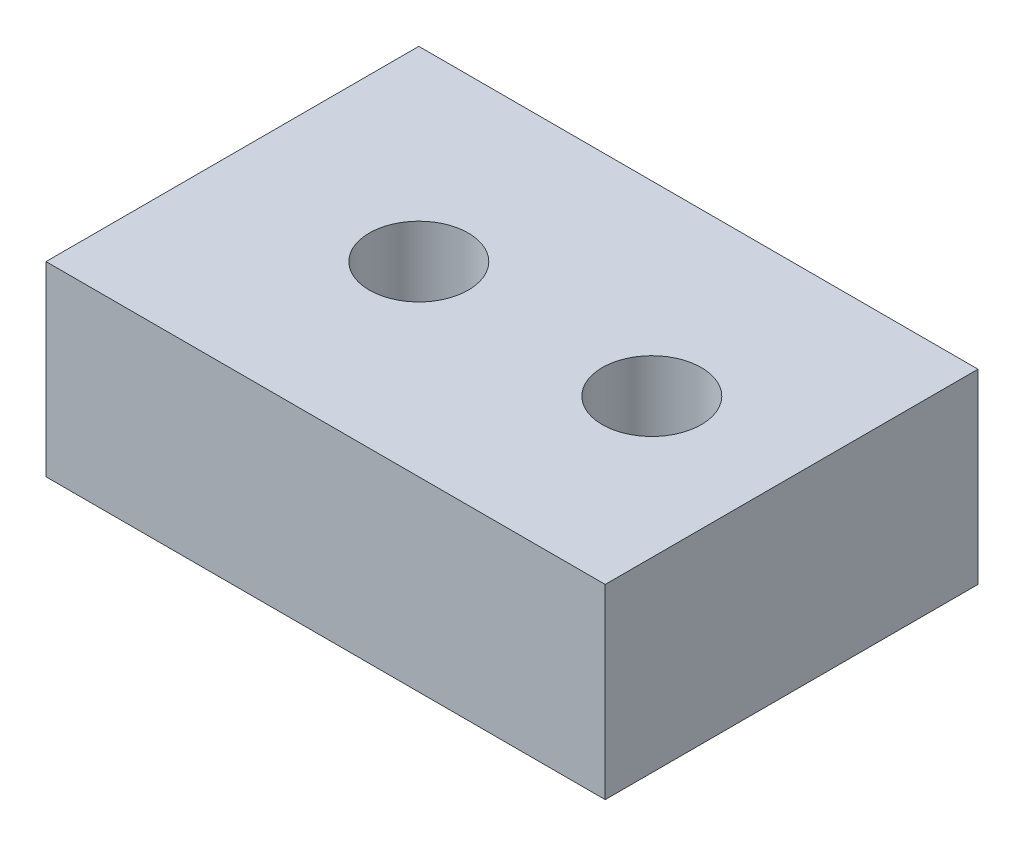
ISO-10303-21;
HEADER;
FILE_DESCRIPTION(('STEP AP214'),'2;1');
FILE_NAME('part.step','',(''),(''),'','','');
FILE_SCHEMA(('AUTOMOTIVE_DESIGN { 1 0 10303 214 1 1 1 1 }'));
ENDSEC;
DATA;
#1=APPLICATION_CONTEXT('core data for automotive mechanical design processes');
#2=APPLICATION_PROTOCOL_DEFINITION('international standard','automotive_design',2000,#1);
#3=PRODUCT_CONTEXT('',#1,'mechanical');
#4=PRODUCT('Part','Part','',(#3));
#5=PRODUCT_RELATED_PRODUCT_CATEGORY('part','',(#4));
#6=PRODUCT_DEFINITION_FORMATION('','',#4);
#7=PRODUCT_DEFINITION_CONTEXT('part definition',#1,'design');
#8=PRODUCT_DEFINITION('design','',#6,#7);
#9=PRODUCT_DEFINITION_SHAPE('','',#8);
#10=(LENGTH_UNIT() NAMED_UNIT(*) SI_UNIT(.MILLI.,.METRE.));
#11=(NAMED_UNIT(*) PLANE_ANGLE_UNIT() SI_UNIT($,.RADIAN.));
#12=(NAMED_UNIT(*) SI_UNIT($,.STERADIAN.) SOLID_ANGLE_UNIT());
#13=UNCERTAINTY_MEASURE_WITH_UNIT(LENGTH_MEASURE(1.E-05),#10,'distance_accuracy_value','');
#14=(GEOMETRIC_REPRESENTATION_CONTEXT(3) GLOBAL_UNCERTAINTY_ASSIGNED_CONTEXT((#13)) GLOBAL_UNIT_ASSIGNED_CONTEXT((#10,
#11,#12)) REPRESENTATION_CONTEXT('',''));
#15=CARTESIAN_POINT('',(0.,0.,0.));
#16=DIRECTION('',(0.,0.,1.));
#17=DIRECTION('',(1.,0.,0.));
#18=AXIS2_PLACEMENT_3D('',#15,#16,#17);
#19=CARTESIAN_POINT('',(0.,12.7,0.));
#20=DIRECTION('',(0.,-1.,0.));
#21=DIRECTION('',(0.,0.,-1.));
#22=AXIS2_PLACEMENT_3D('',#19,#20,#21);
#23=PLANE('',#22);
#24=DIRECTION('',(0.,0.,-1.));
#25=VECTOR('',#24,1.);
#26=CARTESIAN_POINT('',(19.05,12.7,12.7));
#27=LINE('',#26,#25);
#28=CARTESIAN_POINT('',(19.05,12.7,12.7));
#29=VERTEX_POINT('',#28);
#30=CARTESIAN_POINT('',(19.05,12.7,-12.7));
#31=VERTEX_POINT('',#30);
#32=EDGE_CURVE('E94',#29,#31,#27,.T.);
#33=ORIENTED_EDGE('',*,*,#32,.T.);
#34=DIRECTION('',(-1.,0.,0.));
#35=VECTOR('',#34,1.);
#36=CARTESIAN_POINT('',(-19.05,12.7,-12.7));
#37=LINE('',#36,#35);
#38=CARTESIAN_POINT('',(-19.05,12.7,-12.7));
#39=VERTEX_POINT('',#38);
#40=EDGE_CURVE('E89',#31,#39,#37,.T.);
#41=ORIENTED_EDGE('',*,*,#40,.T.);
#42=DIRECTION('',(0.,0.,1.));
#43=VECTOR('',#42,1.);
#44=CARTESIAN_POINT('',(-19.05,12.7,12.7));
#45=LINE('',#44,#43);
#46=CARTESIAN_POINT('',(-19.05,12.7,12.7));
#47=VERTEX_POINT('',#46);
#48=EDGE_CURVE('E92',#39,#47,#45,.T.);
#49=ORIENTED_EDGE('',*,*,#48,.T.);
#50=DIRECTION('',(1.,0.,0.));
#51=VECTOR('',#50,1.);
#52=CARTESIAN_POINT('',(-19.05,12.7,12.7));
#53=LINE('',#52,#51);
#54=EDGE_CURVE('E59',#47,#29,#53,.T.);
#55=ORIENTED_EDGE('',*,*,#54,.T.);
#56=EDGE_LOOP('',(#33,#41,#49,#55));
#57=FACE_BOUND('',#56,.T.);
#58=CARTESIAN_POINT('',(-6.35,12.7,0.));
#59=DIRECTION('',(0.,1.,0.));
#60=DIRECTION('',(0.,0.,1.));
#61=AXIS2_PLACEMENT_3D('',#58,#59,#60);
#62=CIRCLE('',#61,3.3734375);
#63=CARTESIAN_POINT('',(-6.35,12.7,3.3734375));
#64=VERTEX_POINT('',#63);
#65=EDGE_CURVE('E114',#64,#64,#62,.T.);
#66=ORIENTED_EDGE('',*,*,#65,.F.);
#67=EDGE_LOOP('',(#66));
#68=FACE_BOUND('',#67,.T.);
#69=CARTESIAN_POINT('',(9.525,12.7,0.));
#70=DIRECTION('',(0.,1.,0.));
#71=DIRECTION('',(0.,0.,1.));
#72=AXIS2_PLACEMENT_3D('',#69,#70,#71);
#73=CIRCLE('',#72,3.3734375);
#74=CARTESIAN_POINT('',(9.525,12.7,3.3734375));
#75=VERTEX_POINT('',#74);
#76=EDGE_CURVE('E136',#75,#75,#73,.T.);
#77=ORIENTED_EDGE('',*,*,#76,.F.);
#78=EDGE_LOOP('',(#77));
#79=FACE_BOUND('',#78,.T.);
#80=ADVANCED_FACE('F41',(#57,#68,#79),#23,.F.);
#81=CARTESIAN_POINT('',(0.,0.,0.));
#82=DIRECTION('',(0.,-1.,0.));
#83=DIRECTION('',(0.,0.,-1.));
#84=AXIS2_PLACEMENT_3D('',#81,#82,#83);
#85=PLANE('',#84);
#86=CARTESIAN_POINT('',(-6.35,0.,0.));
#87=DIRECTION('',(0.,1.,0.));
#88=DIRECTION('',(0.,0.,1.));
#89=AXIS2_PLACEMENT_3D('',#86,#87,#88);
#90=CIRCLE('',#89,3.3734375);
#91=CARTESIAN_POINT('',(-6.35,0.,3.3734375));
#92=VERTEX_POINT('',#91);
#93=EDGE_CURVE('E132',#92,#92,#90,.T.);
#94=ORIENTED_EDGE('',*,*,#93,.T.);
#95=EDGE_LOOP('',(#94));
#96=FACE_BOUND('',#95,.T.);
#97=DIRECTION('',(0.,0.,-1.));
#98=VECTOR('',#97,1.);
#99=CARTESIAN_POINT('',(19.05,0.,12.7));
#100=LINE('',#99,#98);
#101=CARTESIAN_POINT('',(19.05,0.,12.7));
#102=VERTEX_POINT('',#101);
#103=CARTESIAN_POINT('',(19.05,0.,-12.7));
#104=VERTEX_POINT('',#103);
#105=EDGE_CURVE('E110',#102,#104,#100,.T.);
#106=ORIENTED_EDGE('',*,*,#105,.F.);
#107=DIRECTION('',(1.,0.,0.));
#108=VECTOR('',#107,1.);
#109=CARTESIAN_POINT('',(-19.05,0.,12.7));
#110=LINE('',#109,#108);
#111=CARTESIAN_POINT('',(-19.05,0.,12.7));
#112=VERTEX_POINT('',#111);
#113=EDGE_CURVE('E82',#112,#102,#110,.T.);
#114=ORIENTED_EDGE('',*,*,#113,.F.);
#115=DIRECTION('',(0.,0.,1.));
#116=VECTOR('',#115,1.);
#117=CARTESIAN_POINT('',(-19.05,0.,12.7));
#118=LINE('',#117,#116);
#119=CARTESIAN_POINT('',(-19.05,0.,-12.7));
#120=VERTEX_POINT('',#119);
#121=EDGE_CURVE('E76',#120,#112,#118,.T.);
#122=ORIENTED_EDGE('',*,*,#121,.F.);
#123=DIRECTION('',(-1.,0.,0.));
#124=VECTOR('',#123,1.);
#125=CARTESIAN_POINT('',(-19.05,0.,-12.7));
#126=LINE('',#125,#124);
#127=EDGE_CURVE('E99',#104,#120,#126,.T.);
#128=ORIENTED_EDGE('',*,*,#127,.F.);
#129=EDGE_LOOP('',(#106,#114,#122,#128));
#130=FACE_BOUND('',#129,.T.);
#131=CARTESIAN_POINT('',(9.525,0.,0.));
#132=DIRECTION('',(0.,1.,0.));
#133=DIRECTION('',(0.,0.,1.));
#134=AXIS2_PLACEMENT_3D('',#131,#132,#133);
#135=CIRCLE('',#134,3.3734375);
#136=CARTESIAN_POINT('',(9.525,0.,3.3734375));
#137=VERTEX_POINT('',#136);
#138=EDGE_CURVE('E140',#137,#137,#135,.T.);
#139=ORIENTED_EDGE('',*,*,#138,.T.);
#140=EDGE_LOOP('',(#139));
#141=FACE_BOUND('',#140,.T.);
#142=ADVANCED_FACE('F127',(#96,#130,#141),#85,.T.);
#143=CARTESIAN_POINT('',(19.05,12.7,12.7));
#144=DIRECTION('',(-1.,0.,0.));
#145=DIRECTION('',(0.,0.,1.));
#146=AXIS2_PLACEMENT_3D('',#143,#144,#145);
#147=PLANE('',#146);
#148=ORIENTED_EDGE('',*,*,#105,.T.);
#149=DIRECTION('',(0.,-1.,0.));
#150=VECTOR('',#149,1.);
#151=CARTESIAN_POINT('',(19.05,12.7,-12.7));
#152=LINE('',#151,#150);
#153=EDGE_CURVE('E11',#31,#104,#152,.T.);
#154=ORIENTED_EDGE('',*,*,#153,.F.);
#155=ORIENTED_EDGE('',*,*,#32,.F.);
#156=DIRECTION('',(0.,-1.,0.));
#157=VECTOR('',#156,1.);
#158=CARTESIAN_POINT('',(19.05,12.7,12.7));
#159=LINE('',#158,#157);
#160=EDGE_CURVE('E106',#29,#102,#159,.T.);
#161=ORIENTED_EDGE('',*,*,#160,.T.);
#162=EDGE_LOOP('',(#148,#154,#155,#161));
#163=FACE_BOUND('',#162,.T.);
#164=ADVANCED_FACE('F43',(#163),#147,.F.);
#165=CARTESIAN_POINT('',(-19.05,12.7,-12.7));
#166=DIRECTION('',(0.,0.,1.));
#167=DIRECTION('',(1.,0.,0.));
#168=AXIS2_PLACEMENT_3D('',#165,#166,#167);
#169=PLANE('',#168);
#170=ORIENTED_EDGE('',*,*,#127,.T.);
#171=DIRECTION('',(0.,-1.,0.));
#172=VECTOR('',#171,1.);
#173=CARTESIAN_POINT('',(-19.05,12.7,-12.7));
#174=LINE('',#173,#172);
#175=EDGE_CURVE('E51',#39,#120,#174,.T.);
#176=ORIENTED_EDGE('',*,*,#175,.F.);
#177=ORIENTED_EDGE('',*,*,#40,.F.);
#178=ORIENTED_EDGE('',*,*,#153,.T.);
#179=EDGE_LOOP('',(#170,#176,#177,#178));
#180=FACE_BOUND('',#179,.T.);
#181=ADVANCED_FACE('F98',(#180),#169,.F.);
#182=CARTESIAN_POINT('',(-19.05,12.7,12.7));
#183=DIRECTION('',(1.,0.,0.));
#184=DIRECTION('',(0.,0.,-1.));
#185=AXIS2_PLACEMENT_3D('',#182,#183,#184);
#186=PLANE('',#185);
#187=ORIENTED_EDGE('',*,*,#121,.T.);
#188=DIRECTION('',(0.,-1.,0.));
#189=VECTOR('',#188,1.);
#190=CARTESIAN_POINT('',(-19.05,12.7,12.7));
#191=LINE('',#190,#189);
#192=EDGE_CURVE('E101',#47,#112,#191,.T.);
#193=ORIENTED_EDGE('',*,*,#192,.F.);
#194=ORIENTED_EDGE('',*,*,#48,.F.);
#195=ORIENTED_EDGE('',*,*,#175,.T.);
#196=EDGE_LOOP('',(#187,#193,#194,#195));
#197=FACE_BOUND('',#196,.T.);
#198=ADVANCED_FACE('F102',(#197),#186,.F.);
#199=CARTESIAN_POINT('',(-19.05,12.7,12.7));
#200=DIRECTION('',(0.,0.,-1.));
#201=DIRECTION('',(-1.,0.,0.));
#202=AXIS2_PLACEMENT_3D('',#199,#200,#201);
#203=PLANE('',#202);
#204=ORIENTED_EDGE('',*,*,#113,.T.);
#205=ORIENTED_EDGE('',*,*,#160,.F.);
#206=ORIENTED_EDGE('',*,*,#54,.F.);
#207=ORIENTED_EDGE('',*,*,#192,.T.);
#208=EDGE_LOOP('',(#204,#205,#206,#207));
#209=FACE_BOUND('',#208,.T.);
#210=ADVANCED_FACE('F124',(#209),#203,.F.);
#211=CARTESIAN_POINT('',(-6.35,12.7,0.));
#212=DIRECTION('',(0.,-1.,0.));
#213=DIRECTION('',(0.,0.,-1.));
#214=AXIS2_PLACEMENT_3D('',#211,#212,#213);
#215=CYLINDRICAL_SURFACE('',#214,3.3734375);
#216=ORIENTED_EDGE('',*,*,#65,.T.);
#217=EDGE_LOOP('',(#216));
#218=FACE_BOUND('',#217,.T.);
#219=ORIENTED_EDGE('',*,*,#93,.F.);
#220=EDGE_LOOP('',(#219));
#221=FACE_BOUND('',#220,.T.);
#222=ADVANCED_FACE('F159',(#218,#221),#215,.F.);
#223=CARTESIAN_POINT('',(9.525,12.7,0.));
#224=DIRECTION('',(0.,-1.,0.));
#225=DIRECTION('',(0.,0.,-1.));
#226=AXIS2_PLACEMENT_3D('',#223,#224,#225);
#227=CYLINDRICAL_SURFACE('',#226,3.3734375);
#228=ORIENTED_EDGE('',*,*,#76,.T.);
#229=EDGE_LOOP('',(#228));
#230=FACE_BOUND('',#229,.T.);
#231=ORIENTED_EDGE('',*,*,#138,.F.);
#232=EDGE_LOOP('',(#231));
#233=FACE_BOUND('',#232,.T.);
#234=ADVANCED_FACE('F148',(#230,#233),#227,.F.);
#235=CLOSED_SHELL('',(#80,#142,#164,#181,#198,#210,#222,#234));
#236=MANIFOLD_SOLID_BREP('B2',#235);
#237=ADVANCED_BREP_SHAPE_REPRESENTATION('',(#18,#236),#14);
#238=SHAPE_DEFINITION_REPRESENTATION(#9,#237);
ENDSEC;
END-ISO-10303-21;
